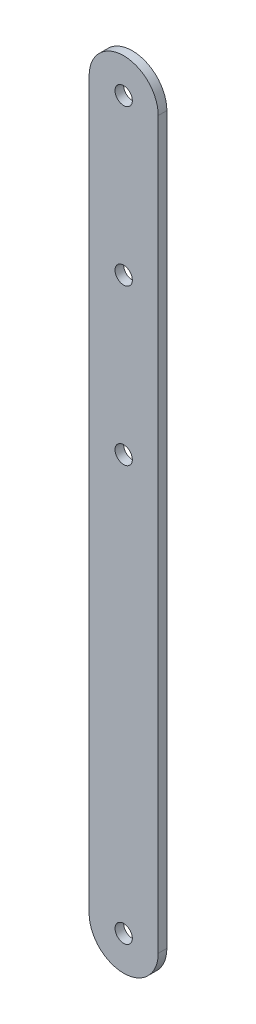
ISO-10303-21;
HEADER;
FILE_DESCRIPTION(('STEP AP214'),'2;1');
FILE_NAME('part.step','',(''),(''),'','','');
FILE_SCHEMA(('AUTOMOTIVE_DESIGN { 1 0 10303 214 1 1 1 1 }'));
ENDSEC;
DATA;
#1=APPLICATION_CONTEXT('core data for automotive mechanical design processes');
#2=APPLICATION_PROTOCOL_DEFINITION('international standard','automotive_design',2000,#1);
#3=PRODUCT_CONTEXT('',#1,'mechanical');
#4=PRODUCT('Part','Part','',(#3));
#5=PRODUCT_RELATED_PRODUCT_CATEGORY('part','',(#4));
#6=PRODUCT_DEFINITION_FORMATION('','',#4);
#7=PRODUCT_DEFINITION_CONTEXT('part definition',#1,'design');
#8=PRODUCT_DEFINITION('design','',#6,#7);
#9=PRODUCT_DEFINITION_SHAPE('','',#8);
#10=(LENGTH_UNIT() NAMED_UNIT(*) SI_UNIT(.MILLI.,.METRE.));
#11=(NAMED_UNIT(*) PLANE_ANGLE_UNIT() SI_UNIT($,.RADIAN.));
#12=(NAMED_UNIT(*) SI_UNIT($,.STERADIAN.) SOLID_ANGLE_UNIT());
#13=UNCERTAINTY_MEASURE_WITH_UNIT(LENGTH_MEASURE(1.E-05),#10,'distance_accuracy_value','');
#14=(GEOMETRIC_REPRESENTATION_CONTEXT(3) GLOBAL_UNCERTAINTY_ASSIGNED_CONTEXT((#13)) GLOBAL_UNIT_ASSIGNED_CONTEXT((#10,
#11,#12)) REPRESENTATION_CONTEXT('',''));
#15=CARTESIAN_POINT('',(0.,0.,0.));
#16=DIRECTION('',(0.,0.,1.));
#17=DIRECTION('',(1.,0.,0.));
#18=AXIS2_PLACEMENT_3D('',#15,#16,#17);
#19=CARTESIAN_POINT('',(0.,-1066.8,12.7));
#20=DIRECTION('',(0.,0.,1.));
#21=DIRECTION('',(1.,0.,0.));
#22=AXIS2_PLACEMENT_3D('',#19,#20,#21);
#23=PLANE('',#22);
#24=CARTESIAN_POINT('',(0.,-228.6,12.7));
#25=DIRECTION('',(0.,0.,1.));
#26=DIRECTION('',(1.,0.,0.));
#27=AXIS2_PLACEMENT_3D('',#24,#25,#26);
#28=CIRCLE('',#27,12.7);
#29=CARTESIAN_POINT('',(12.7,-228.6,12.7));
#30=VERTEX_POINT('',#29);
#31=EDGE_CURVE('E124',#30,#30,#28,.T.);
#32=ORIENTED_EDGE('',*,*,#31,.F.);
#33=EDGE_LOOP('',(#32));
#34=FACE_BOUND('',#33,.T.);
#35=CARTESIAN_POINT('',(0.,0.,12.7));
#36=DIRECTION('',(0.,0.,1.));
#37=DIRECTION('',(1.,0.,0.));
#38=AXIS2_PLACEMENT_3D('',#35,#36,#37);
#39=CIRCLE('',#38,12.7);
#40=CARTESIAN_POINT('',(12.7,0.,12.7));
#41=VERTEX_POINT('',#40);
#42=EDGE_CURVE('E103',#41,#41,#39,.T.);
#43=ORIENTED_EDGE('',*,*,#42,.F.);
#44=EDGE_LOOP('',(#43));
#45=FACE_BOUND('',#44,.T.);
#46=CARTESIAN_POINT('',(0.,-1066.8,12.7));
#47=DIRECTION('',(0.,0.,1.));
#48=DIRECTION('',(1.,0.,0.));
#49=AXIS2_PLACEMENT_3D('',#46,#47,#48);
#50=CIRCLE('',#49,50.7999999999999);
#51=CARTESIAN_POINT('',(-50.7999999999999,-1066.8,12.7));
#52=VERTEX_POINT('',#51);
#53=CARTESIAN_POINT('',(50.7999999999999,-1066.8,12.7));
#54=VERTEX_POINT('',#53);
#55=EDGE_CURVE('E88',#52,#54,#50,.T.);
#56=ORIENTED_EDGE('',*,*,#55,.T.);
#57=DIRECTION('',(0.,1.,0.));
#58=VECTOR('',#57,1.);
#59=CARTESIAN_POINT('',(50.7999999999999,0.,12.7));
#60=LINE('',#59,#58);
#61=CARTESIAN_POINT('',(50.7999999999999,0.,12.7));
#62=VERTEX_POINT('',#61);
#63=EDGE_CURVE('E83',#54,#62,#60,.T.);
#64=ORIENTED_EDGE('',*,*,#63,.T.);
#65=CARTESIAN_POINT('',(0.,0.,12.7));
#66=DIRECTION('',(0.,0.,1.));
#67=DIRECTION('',(1.,0.,0.));
#68=AXIS2_PLACEMENT_3D('',#65,#66,#67);
#69=CIRCLE('',#68,50.7999999999999);
#70=CARTESIAN_POINT('',(-50.7999999999999,0.,12.7));
#71=VERTEX_POINT('',#70);
#72=EDGE_CURVE('E86',#62,#71,#69,.T.);
#73=ORIENTED_EDGE('',*,*,#72,.T.);
#74=DIRECTION('',(0.,-1.,0.));
#75=VECTOR('',#74,1.);
#76=CARTESIAN_POINT('',(-50.7999999999999,-1066.8,12.7));
#77=LINE('',#76,#75);
#78=EDGE_CURVE('E53',#71,#52,#77,.T.);
#79=ORIENTED_EDGE('',*,*,#78,.T.);
#80=EDGE_LOOP('',(#56,#64,#73,#79));
#81=FACE_BOUND('',#80,.T.);
#82=CARTESIAN_POINT('',(0.,-1066.8,12.7));
#83=DIRECTION('',(0.,0.,1.));
#84=DIRECTION('',(1.,0.,0.));
#85=AXIS2_PLACEMENT_3D('',#82,#83,#84);
#86=CIRCLE('',#85,12.7);
#87=CARTESIAN_POINT('',(12.7,-1066.8,12.7));
#88=VERTEX_POINT('',#87);
#89=EDGE_CURVE('E118',#88,#88,#86,.T.);
#90=ORIENTED_EDGE('',*,*,#89,.F.);
#91=EDGE_LOOP('',(#90));
#92=FACE_BOUND('',#91,.T.);
#93=CARTESIAN_POINT('',(0.,-457.2,12.7));
#94=DIRECTION('',(0.,0.,1.));
#95=DIRECTION('',(1.,0.,0.));
#96=AXIS2_PLACEMENT_3D('',#93,#94,#95);
#97=CIRCLE('',#96,12.7);
#98=CARTESIAN_POINT('',(12.7000000000001,-457.2,12.7));
#99=VERTEX_POINT('',#98);
#100=EDGE_CURVE('E130',#99,#99,#97,.T.);
#101=ORIENTED_EDGE('',*,*,#100,.F.);
#102=EDGE_LOOP('',(#101));
#103=FACE_BOUND('',#102,.T.);
#104=ADVANCED_FACE('F36',(#34,#45,#81,#92,#103),#23,.T.);
#105=CARTESIAN_POINT('',(0.,-1066.8,0.));
#106=DIRECTION('',(0.,0.,1.));
#107=DIRECTION('',(1.,0.,0.));
#108=AXIS2_PLACEMENT_3D('',#105,#106,#107);
#109=PLANE('',#108);
#110=CARTESIAN_POINT('',(0.,-1066.8,0.));
#111=DIRECTION('',(0.,0.,1.));
#112=DIRECTION('',(1.,0.,0.));
#113=AXIS2_PLACEMENT_3D('',#110,#111,#112);
#114=CIRCLE('',#113,50.7999999999999);
#115=CARTESIAN_POINT('',(-50.7999999999999,-1066.8,0.));
#116=VERTEX_POINT('',#115);
#117=CARTESIAN_POINT('',(50.7999999999999,-1066.8,0.));
#118=VERTEX_POINT('',#117);
#119=EDGE_CURVE('E100',#116,#118,#114,.T.);
#120=ORIENTED_EDGE('',*,*,#119,.F.);
#121=DIRECTION('',(0.,-1.,0.));
#122=VECTOR('',#121,1.);
#123=CARTESIAN_POINT('',(-50.7999999999999,-1066.8,0.));
#124=LINE('',#123,#122);
#125=CARTESIAN_POINT('',(-50.7999999999999,0.,0.));
#126=VERTEX_POINT('',#125);
#127=EDGE_CURVE('E76',#126,#116,#124,.T.);
#128=ORIENTED_EDGE('',*,*,#127,.F.);
#129=CARTESIAN_POINT('',(0.,0.,0.));
#130=DIRECTION('',(0.,0.,1.));
#131=DIRECTION('',(1.,0.,0.));
#132=AXIS2_PLACEMENT_3D('',#129,#130,#131);
#133=CIRCLE('',#132,50.7999999999999);
#134=CARTESIAN_POINT('',(50.7999999999999,0.,0.));
#135=VERTEX_POINT('',#134);
#136=EDGE_CURVE('E70',#135,#126,#133,.T.);
#137=ORIENTED_EDGE('',*,*,#136,.F.);
#138=DIRECTION('',(0.,1.,0.));
#139=VECTOR('',#138,1.);
#140=CARTESIAN_POINT('',(50.7999999999999,0.,0.));
#141=LINE('',#140,#139);
#142=EDGE_CURVE('E92',#118,#135,#141,.T.);
#143=ORIENTED_EDGE('',*,*,#142,.F.);
#144=EDGE_LOOP('',(#120,#128,#137,#143));
#145=FACE_BOUND('',#144,.T.);
#146=CARTESIAN_POINT('',(0.,0.,0.));
#147=DIRECTION('',(0.,0.,1.));
#148=DIRECTION('',(1.,0.,0.));
#149=AXIS2_PLACEMENT_3D('',#146,#147,#148);
#150=CIRCLE('',#149,12.7);
#151=CARTESIAN_POINT('',(12.7,0.,0.));
#152=VERTEX_POINT('',#151);
#153=EDGE_CURVE('E115',#152,#152,#150,.T.);
#154=ORIENTED_EDGE('',*,*,#153,.T.);
#155=EDGE_LOOP('',(#154));
#156=FACE_BOUND('',#155,.T.);
#157=CARTESIAN_POINT('',(0.,-1066.8,0.));
#158=DIRECTION('',(0.,0.,1.));
#159=DIRECTION('',(1.,0.,0.));
#160=AXIS2_PLACEMENT_3D('',#157,#158,#159);
#161=CIRCLE('',#160,12.7);
#162=CARTESIAN_POINT('',(12.7,-1066.8,0.));
#163=VERTEX_POINT('',#162);
#164=EDGE_CURVE('E121',#163,#163,#161,.T.);
#165=ORIENTED_EDGE('',*,*,#164,.T.);
#166=EDGE_LOOP('',(#165));
#167=FACE_BOUND('',#166,.T.);
#168=CARTESIAN_POINT('',(0.,-228.6,0.));
#169=DIRECTION('',(0.,0.,1.));
#170=DIRECTION('',(1.,0.,0.));
#171=AXIS2_PLACEMENT_3D('',#168,#169,#170);
#172=CIRCLE('',#171,12.7);
#173=CARTESIAN_POINT('',(12.7,-228.6,0.));
#174=VERTEX_POINT('',#173);
#175=EDGE_CURVE('E127',#174,#174,#172,.T.);
#176=ORIENTED_EDGE('',*,*,#175,.T.);
#177=EDGE_LOOP('',(#176));
#178=FACE_BOUND('',#177,.T.);
#179=CARTESIAN_POINT('',(0.,-457.2,0.));
#180=DIRECTION('',(0.,0.,1.));
#181=DIRECTION('',(1.,0.,0.));
#182=AXIS2_PLACEMENT_3D('',#179,#180,#181);
#183=CIRCLE('',#182,12.7);
#184=CARTESIAN_POINT('',(12.7000000000001,-457.2,0.));
#185=VERTEX_POINT('',#184);
#186=EDGE_CURVE('E133',#185,#185,#183,.T.);
#187=ORIENTED_EDGE('',*,*,#186,.T.);
#188=EDGE_LOOP('',(#187));
#189=FACE_BOUND('',#188,.T.);
#190=ADVANCED_FACE('F111',(#145,#156,#167,#178,#189),#109,.F.);
#191=CARTESIAN_POINT('',(0.,-1066.8,12.7));
#192=DIRECTION('',(0.,0.,-1.));
#193=DIRECTION('',(-1.,0.,0.));
#194=AXIS2_PLACEMENT_3D('',#191,#192,#193);
#195=CYLINDRICAL_SURFACE('',#194,50.7999999999999);
#196=ORIENTED_EDGE('',*,*,#119,.T.);
#197=DIRECTION('',(0.,0.,-1.));
#198=VECTOR('',#197,1.);
#199=CARTESIAN_POINT('',(50.7999999999999,-1066.8,12.7));
#200=LINE('',#199,#198);
#201=EDGE_CURVE('E11',#54,#118,#200,.T.);
#202=ORIENTED_EDGE('',*,*,#201,.F.);
#203=ORIENTED_EDGE('',*,*,#55,.F.);
#204=DIRECTION('',(0.,0.,-1.));
#205=VECTOR('',#204,1.);
#206=CARTESIAN_POINT('',(-50.7999999999999,-1066.8,12.7));
#207=LINE('',#206,#205);
#208=EDGE_CURVE('E96',#52,#116,#207,.T.);
#209=ORIENTED_EDGE('',*,*,#208,.T.);
#210=EDGE_LOOP('',(#196,#202,#203,#209));
#211=FACE_BOUND('',#210,.T.);
#212=ADVANCED_FACE('F38',(#211),#195,.T.);
#213=CARTESIAN_POINT('',(50.7999999999999,0.,12.7));
#214=DIRECTION('',(-1.,0.,0.));
#215=DIRECTION('',(0.,0.,1.));
#216=AXIS2_PLACEMENT_3D('',#213,#214,#215);
#217=PLANE('',#216);
#218=ORIENTED_EDGE('',*,*,#142,.T.);
#219=DIRECTION('',(0.,0.,-1.));
#220=VECTOR('',#219,1.);
#221=CARTESIAN_POINT('',(50.7999999999999,0.,12.7));
#222=LINE('',#221,#220);
#223=EDGE_CURVE('E45',#62,#135,#222,.T.);
#224=ORIENTED_EDGE('',*,*,#223,.F.);
#225=ORIENTED_EDGE('',*,*,#63,.F.);
#226=ORIENTED_EDGE('',*,*,#201,.T.);
#227=EDGE_LOOP('',(#218,#224,#225,#226));
#228=FACE_BOUND('',#227,.T.);
#229=ADVANCED_FACE('F91',(#228),#217,.F.);
#230=CARTESIAN_POINT('',(0.,0.,12.7));
#231=DIRECTION('',(0.,0.,-1.));
#232=DIRECTION('',(-1.,0.,0.));
#233=AXIS2_PLACEMENT_3D('',#230,#231,#232);
#234=CYLINDRICAL_SURFACE('',#233,50.7999999999999);
#235=ORIENTED_EDGE('',*,*,#136,.T.);
#236=DIRECTION('',(0.,0.,-1.));
#237=VECTOR('',#236,1.);
#238=CARTESIAN_POINT('',(-50.7999999999999,0.,12.7));
#239=LINE('',#238,#237);
#240=EDGE_CURVE('E93',#71,#126,#239,.T.);
#241=ORIENTED_EDGE('',*,*,#240,.F.);
#242=ORIENTED_EDGE('',*,*,#72,.F.);
#243=ORIENTED_EDGE('',*,*,#223,.T.);
#244=EDGE_LOOP('',(#235,#241,#242,#243));
#245=FACE_BOUND('',#244,.T.);
#246=ADVANCED_FACE('F94',(#245),#234,.T.);
#247=CARTESIAN_POINT('',(-50.7999999999999,-1066.8,12.7));
#248=DIRECTION('',(1.,0.,0.));
#249=DIRECTION('',(0.,0.,-1.));
#250=AXIS2_PLACEMENT_3D('',#247,#248,#249);
#251=PLANE('',#250);
#252=ORIENTED_EDGE('',*,*,#127,.T.);
#253=ORIENTED_EDGE('',*,*,#208,.F.);
#254=ORIENTED_EDGE('',*,*,#78,.F.);
#255=ORIENTED_EDGE('',*,*,#240,.T.);
#256=EDGE_LOOP('',(#252,#253,#254,#255));
#257=FACE_BOUND('',#256,.T.);
#258=ADVANCED_FACE('F108',(#257),#251,.F.);
#259=CARTESIAN_POINT('',(0.,0.,12.7));
#260=DIRECTION('',(0.,0.,-1.));
#261=DIRECTION('',(-1.,0.,0.));
#262=AXIS2_PLACEMENT_3D('',#259,#260,#261);
#263=CYLINDRICAL_SURFACE('',#262,12.7);
#264=ORIENTED_EDGE('',*,*,#42,.T.);
#265=EDGE_LOOP('',(#264));
#266=FACE_BOUND('',#265,.T.);
#267=ORIENTED_EDGE('',*,*,#153,.F.);
#268=EDGE_LOOP('',(#267));
#269=FACE_BOUND('',#268,.T.);
#270=ADVANCED_FACE('F152',(#266,#269),#263,.F.);
#271=CARTESIAN_POINT('',(0.,-1066.8,12.7));
#272=DIRECTION('',(0.,0.,-1.));
#273=DIRECTION('',(-1.,0.,0.));
#274=AXIS2_PLACEMENT_3D('',#271,#272,#273);
#275=CYLINDRICAL_SURFACE('',#274,12.7);
#276=ORIENTED_EDGE('',*,*,#89,.T.);
#277=EDGE_LOOP('',(#276));
#278=FACE_BOUND('',#277,.T.);
#279=ORIENTED_EDGE('',*,*,#164,.F.);
#280=EDGE_LOOP('',(#279));
#281=FACE_BOUND('',#280,.T.);
#282=ADVANCED_FACE('F198',(#278,#281),#275,.F.);
#283=CARTESIAN_POINT('',(0.,-228.6,12.7));
#284=DIRECTION('',(0.,0.,-1.));
#285=DIRECTION('',(-1.,0.,0.));
#286=AXIS2_PLACEMENT_3D('',#283,#284,#285);
#287=CYLINDRICAL_SURFACE('',#286,12.7);
#288=ORIENTED_EDGE('',*,*,#31,.T.);
#289=EDGE_LOOP('',(#288));
#290=FACE_BOUND('',#289,.T.);
#291=ORIENTED_EDGE('',*,*,#175,.F.);
#292=EDGE_LOOP('',(#291));
#293=FACE_BOUND('',#292,.T.);
#294=ADVANCED_FACE('F206',(#290,#293),#287,.F.);
#295=CARTESIAN_POINT('',(0.,-457.2,12.7));
#296=DIRECTION('',(0.,0.,-1.));
#297=DIRECTION('',(-1.,0.,0.));
#298=AXIS2_PLACEMENT_3D('',#295,#296,#297);
#299=CYLINDRICAL_SURFACE('',#298,12.7);
#300=ORIENTED_EDGE('',*,*,#100,.T.);
#301=EDGE_LOOP('',(#300));
#302=FACE_BOUND('',#301,.T.);
#303=ORIENTED_EDGE('',*,*,#186,.F.);
#304=EDGE_LOOP('',(#303));
#305=FACE_BOUND('',#304,.T.);
#306=ADVANCED_FACE('F139',(#302,#305),#299,.F.);
#307=CLOSED_SHELL('',(#104,#190,#212,#229,#246,#258,#270,#282,#294,#306));
#308=MANIFOLD_SOLID_BREP('B2',#307);
#309=ADVANCED_BREP_SHAPE_REPRESENTATION('',(#18,#308),#14);
#310=SHAPE_DEFINITION_REPRESENTATION(#9,#309);
ENDSEC;
END-ISO-10303-21;
